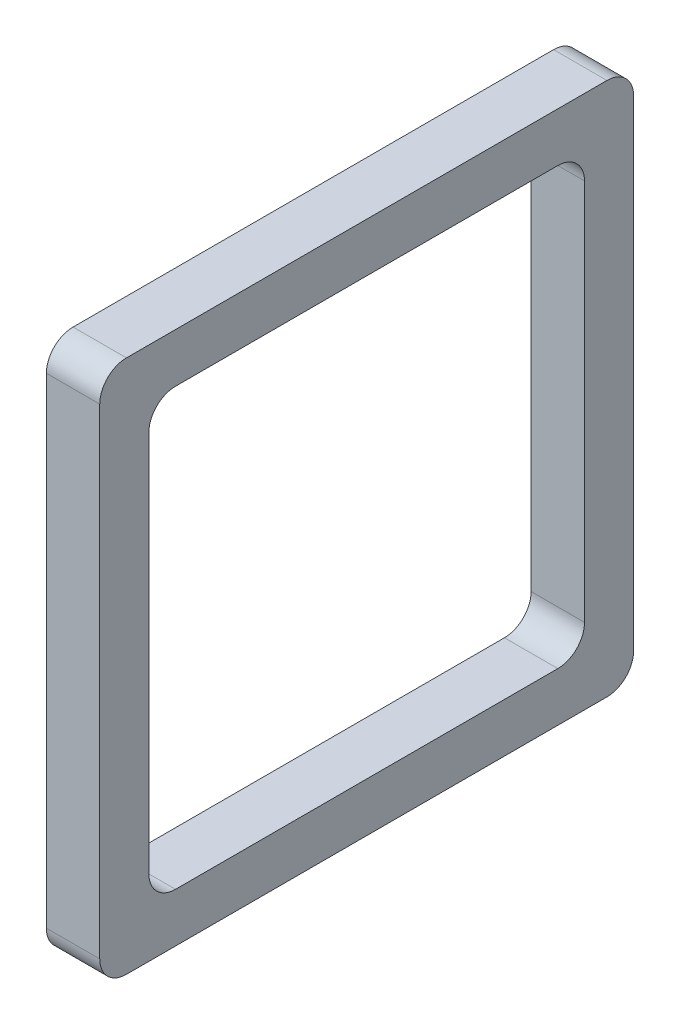
ISO-10303-21;
HEADER;
FILE_DESCRIPTION(('STEP AP214'),'2;1');
FILE_NAME('part.step','',(''),(''),'','','');
FILE_SCHEMA(('AUTOMOTIVE_DESIGN { 1 0 10303 214 1 1 1 1 }'));
ENDSEC;
DATA;
#1=APPLICATION_CONTEXT('core data for automotive mechanical design processes');
#2=APPLICATION_PROTOCOL_DEFINITION('international standard','automotive_design',2000,#1);
#3=PRODUCT_CONTEXT('',#1,'mechanical');
#4=PRODUCT('Part','Part','',(#3));
#5=PRODUCT_RELATED_PRODUCT_CATEGORY('part','',(#4));
#6=PRODUCT_DEFINITION_FORMATION('','',#4);
#7=PRODUCT_DEFINITION_CONTEXT('part definition',#1,'design');
#8=PRODUCT_DEFINITION('design','',#6,#7);
#9=PRODUCT_DEFINITION_SHAPE('','',#8);
#10=(LENGTH_UNIT() NAMED_UNIT(*) SI_UNIT(.MILLI.,.METRE.));
#11=(NAMED_UNIT(*) PLANE_ANGLE_UNIT() SI_UNIT($,.RADIAN.));
#12=(NAMED_UNIT(*) SI_UNIT($,.STERADIAN.) SOLID_ANGLE_UNIT());
#13=UNCERTAINTY_MEASURE_WITH_UNIT(LENGTH_MEASURE(1.E-05),#10,'distance_accuracy_value','');
#14=(GEOMETRIC_REPRESENTATION_CONTEXT(3) GLOBAL_UNCERTAINTY_ASSIGNED_CONTEXT((#13)) GLOBAL_UNIT_ASSIGNED_CONTEXT((#10,
#11,#12)) REPRESENTATION_CONTEXT('',''));
#15=CARTESIAN_POINT('',(0.,0.,0.));
#16=DIRECTION('',(0.,0.,1.));
#17=DIRECTION('',(1.,0.,0.));
#18=AXIS2_PLACEMENT_3D('',#15,#16,#17);
#19=CARTESIAN_POINT('',(1.5875,0.,0.));
#20=DIRECTION('',(-1.,0.,0.));
#21=DIRECTION('',(0.,0.,1.));
#22=AXIS2_PLACEMENT_3D('',#19,#20,#21);
#23=PLANE('',#22);
#24=DIRECTION('',(0.,1.,0.));
#25=VECTOR('',#24,1.);
#26=CARTESIAN_POINT('',(1.5875,0.,-31.75));
#27=LINE('',#26,#25);
#28=CARTESIAN_POINT('',(1.5875,1.5875,-31.75));
#29=VERTEX_POINT('',#28);
#30=CARTESIAN_POINT('',(1.5875,30.1625,-31.75));
#31=VERTEX_POINT('',#30);
#32=EDGE_CURVE('E175',#29,#31,#27,.T.);
#33=ORIENTED_EDGE('',*,*,#32,.T.);
#34=CARTESIAN_POINT('',(1.5875,30.1625,-30.1625));
#35=DIRECTION('',(-1.,0.,0.));
#36=DIRECTION('',(0.,0.,1.));
#37=AXIS2_PLACEMENT_3D('',#34,#35,#36);
#38=CIRCLE('',#37,1.5875);
#39=CARTESIAN_POINT('',(1.5875,31.75,-30.1625));
#40=VERTEX_POINT('',#39);
#41=EDGE_CURVE('E217',#31,#40,#38,.F.);
#42=ORIENTED_EDGE('',*,*,#41,.T.);
#43=DIRECTION('',(0.,0.,1.));
#44=VECTOR('',#43,1.);
#45=CARTESIAN_POINT('',(1.5875,31.75,0.));
#46=LINE('',#45,#44);
#47=CARTESIAN_POINT('',(1.5875,31.75,-1.5875));
#48=VERTEX_POINT('',#47);
#49=EDGE_CURVE('E170',#40,#48,#46,.T.);
#50=ORIENTED_EDGE('',*,*,#49,.T.);
#51=CARTESIAN_POINT('',(1.5875,30.1625,-1.5875));
#52=DIRECTION('',(-1.,0.,0.));
#53=DIRECTION('',(0.,0.,1.));
#54=AXIS2_PLACEMENT_3D('',#51,#52,#53);
#55=CIRCLE('',#54,1.5875);
#56=CARTESIAN_POINT('',(1.5875,30.1625,0.));
#57=VERTEX_POINT('',#56);
#58=EDGE_CURVE('E212',#48,#57,#55,.F.);
#59=ORIENTED_EDGE('',*,*,#58,.T.);
#60=DIRECTION('',(0.,-1.,0.));
#61=VECTOR('',#60,1.);
#62=CARTESIAN_POINT('',(1.5875,0.,0.));
#63=LINE('',#62,#61);
#64=CARTESIAN_POINT('',(1.5875,1.5875,0.));
#65=VERTEX_POINT('',#64);
#66=EDGE_CURVE('E266',#57,#65,#63,.T.);
#67=ORIENTED_EDGE('',*,*,#66,.T.);
#68=CARTESIAN_POINT('',(1.5875,1.5875,-1.5875));
#69=DIRECTION('',(-1.,0.,0.));
#70=DIRECTION('',(0.,0.,1.));
#71=AXIS2_PLACEMENT_3D('',#68,#69,#70);
#72=CIRCLE('',#71,1.5875);
#73=CARTESIAN_POINT('',(1.5875,0.,-1.5875));
#74=VERTEX_POINT('',#73);
#75=EDGE_CURVE('E55',#65,#74,#72,.F.);
#76=ORIENTED_EDGE('',*,*,#75,.T.);
#77=DIRECTION('',(0.,0.,-1.));
#78=VECTOR('',#77,1.);
#79=CARTESIAN_POINT('',(1.5875,0.,0.));
#80=LINE('',#79,#78);
#81=CARTESIAN_POINT('',(1.5875,0.,-30.1625));
#82=VERTEX_POINT('',#81);
#83=EDGE_CURVE('E268',#74,#82,#80,.T.);
#84=ORIENTED_EDGE('',*,*,#83,.T.);
#85=CARTESIAN_POINT('',(1.5875,1.5875,-30.1625));
#86=DIRECTION('',(-1.,0.,0.));
#87=DIRECTION('',(0.,0.,1.));
#88=AXIS2_PLACEMENT_3D('',#85,#86,#87);
#89=CIRCLE('',#88,1.5875);
#90=EDGE_CURVE('E215',#82,#29,#89,.F.);
#91=ORIENTED_EDGE('',*,*,#90,.T.);
#92=EDGE_LOOP('',(#33,#42,#50,#59,#67,#76,#84,#91));
#93=FACE_BOUND('',#92,.T.);
#94=DIRECTION('',(0.,0.,-1.));
#95=VECTOR('',#94,1.);
#96=CARTESIAN_POINT('',(1.5875,2.921,-2.921));
#97=LINE('',#96,#95);
#98=CARTESIAN_POINT('',(1.5875,2.921,-4.5085));
#99=VERTEX_POINT('',#98);
#100=CARTESIAN_POINT('',(1.5875,2.921,-27.2415));
#101=VERTEX_POINT('',#100);
#102=EDGE_CURVE('E260',#99,#101,#97,.T.);
#103=ORIENTED_EDGE('',*,*,#102,.F.);
#104=CARTESIAN_POINT('',(1.5875,4.5085,-4.5085));
#105=DIRECTION('',(-1.,0.,0.));
#106=DIRECTION('',(0.,0.,1.));
#107=AXIS2_PLACEMENT_3D('',#104,#105,#106);
#108=CIRCLE('',#107,1.5875);
#109=CARTESIAN_POINT('',(1.5875,4.5085,-2.921));
#110=VERTEX_POINT('',#109);
#111=EDGE_CURVE('E11',#99,#110,#108,.T.);
#112=ORIENTED_EDGE('',*,*,#111,.T.);
#113=DIRECTION('',(0.,-1.,0.));
#114=VECTOR('',#113,1.);
#115=CARTESIAN_POINT('',(1.5875,2.921,-2.921));
#116=LINE('',#115,#114);
#117=CARTESIAN_POINT('',(1.5875,27.2415,-2.921));
#118=VERTEX_POINT('',#117);
#119=EDGE_CURVE('E246',#118,#110,#116,.T.);
#120=ORIENTED_EDGE('',*,*,#119,.F.);
#121=CARTESIAN_POINT('',(1.5875,27.2415,-4.5085));
#122=DIRECTION('',(-1.,0.,0.));
#123=DIRECTION('',(0.,0.,1.));
#124=AXIS2_PLACEMENT_3D('',#121,#122,#123);
#125=CIRCLE('',#124,1.5875);
#126=CARTESIAN_POINT('',(1.5875,28.829,-4.5085));
#127=VERTEX_POINT('',#126);
#128=EDGE_CURVE('E157',#118,#127,#125,.T.);
#129=ORIENTED_EDGE('',*,*,#128,.T.);
#130=DIRECTION('',(0.,0.,1.));
#131=VECTOR('',#130,1.);
#132=CARTESIAN_POINT('',(1.5875,28.829,-2.921));
#133=LINE('',#132,#131);
#134=CARTESIAN_POINT('',(1.5875,28.829,-27.2415));
#135=VERTEX_POINT('',#134);
#136=EDGE_CURVE('E243',#135,#127,#133,.T.);
#137=ORIENTED_EDGE('',*,*,#136,.F.);
#138=CARTESIAN_POINT('',(1.5875,27.2415,-27.2415));
#139=DIRECTION('',(-1.,0.,0.));
#140=DIRECTION('',(0.,0.,1.));
#141=AXIS2_PLACEMENT_3D('',#138,#139,#140);
#142=CIRCLE('',#141,1.5875);
#143=CARTESIAN_POINT('',(1.5875,27.2415,-28.829));
#144=VERTEX_POINT('',#143);
#145=EDGE_CURVE('E234',#135,#144,#142,.T.);
#146=ORIENTED_EDGE('',*,*,#145,.T.);
#147=DIRECTION('',(0.,1.,0.));
#148=VECTOR('',#147,1.);
#149=CARTESIAN_POINT('',(1.5875,2.921,-28.829));
#150=LINE('',#149,#148);
#151=CARTESIAN_POINT('',(1.5875,4.5085,-28.829));
#152=VERTEX_POINT('',#151);
#153=EDGE_CURVE('E254',#152,#144,#150,.T.);
#154=ORIENTED_EDGE('',*,*,#153,.F.);
#155=CARTESIAN_POINT('',(1.5875,4.5085,-27.2415));
#156=DIRECTION('',(-1.,0.,0.));
#157=DIRECTION('',(0.,0.,1.));
#158=AXIS2_PLACEMENT_3D('',#155,#156,#157);
#159=CIRCLE('',#158,1.5875);
#160=EDGE_CURVE('E230',#152,#101,#159,.T.);
#161=ORIENTED_EDGE('',*,*,#160,.T.);
#162=EDGE_LOOP('',(#103,#112,#120,#129,#137,#146,#154,#161));
#163=FACE_BOUND('',#162,.T.);
#164=ADVANCED_FACE('F33',(#93,#163),#23,.F.);
#165=CARTESIAN_POINT('',(-1.5875,0.,0.));
#166=DIRECTION('',(-1.,0.,0.));
#167=DIRECTION('',(0.,0.,1.));
#168=AXIS2_PLACEMENT_3D('',#165,#166,#167);
#169=PLANE('',#168);
#170=DIRECTION('',(0.,0.,1.));
#171=VECTOR('',#170,1.);
#172=CARTESIAN_POINT('',(-1.5875,31.75,0.));
#173=LINE('',#172,#171);
#174=CARTESIAN_POINT('',(-1.5875,31.75,-30.1625));
#175=VERTEX_POINT('',#174);
#176=CARTESIAN_POINT('',(-1.5875,31.75,-1.5875));
#177=VERTEX_POINT('',#176);
#178=EDGE_CURVE('E178',#175,#177,#173,.T.);
#179=ORIENTED_EDGE('',*,*,#178,.F.);
#180=CARTESIAN_POINT('',(-1.5875,30.1625,-30.1625));
#181=DIRECTION('',(-1.,0.,0.));
#182=DIRECTION('',(0.,0.,1.));
#183=AXIS2_PLACEMENT_3D('',#180,#181,#182);
#184=CIRCLE('',#183,1.5875);
#185=CARTESIAN_POINT('',(-1.5875,30.1625,-31.75));
#186=VERTEX_POINT('',#185);
#187=EDGE_CURVE('E205',#175,#186,#184,.T.);
#188=ORIENTED_EDGE('',*,*,#187,.T.);
#189=DIRECTION('',(0.,1.,0.));
#190=VECTOR('',#189,1.);
#191=CARTESIAN_POINT('',(-1.5875,0.,-31.75));
#192=LINE('',#191,#190);
#193=CARTESIAN_POINT('',(-1.5875,1.5875,-31.75));
#194=VERTEX_POINT('',#193);
#195=EDGE_CURVE('E276',#194,#186,#192,.T.);
#196=ORIENTED_EDGE('',*,*,#195,.F.);
#197=CARTESIAN_POINT('',(-1.5875,1.5875,-30.1625));
#198=DIRECTION('',(-1.,0.,0.));
#199=DIRECTION('',(0.,0.,1.));
#200=AXIS2_PLACEMENT_3D('',#197,#198,#199);
#201=CIRCLE('',#200,1.5875);
#202=CARTESIAN_POINT('',(-1.5875,0.,-30.1625));
#203=VERTEX_POINT('',#202);
#204=EDGE_CURVE('E203',#194,#203,#201,.T.);
#205=ORIENTED_EDGE('',*,*,#204,.T.);
#206=DIRECTION('',(0.,0.,-1.));
#207=VECTOR('',#206,1.);
#208=CARTESIAN_POINT('',(-1.5875,0.,0.));
#209=LINE('',#208,#207);
#210=CARTESIAN_POINT('',(-1.5875,0.,-1.5875));
#211=VERTEX_POINT('',#210);
#212=EDGE_CURVE('E275',#211,#203,#209,.T.);
#213=ORIENTED_EDGE('',*,*,#212,.F.);
#214=CARTESIAN_POINT('',(-1.5875,1.5875,-1.5875));
#215=DIRECTION('',(-1.,0.,0.));
#216=DIRECTION('',(0.,0.,1.));
#217=AXIS2_PLACEMENT_3D('',#214,#215,#216);
#218=CIRCLE('',#217,1.5875);
#219=CARTESIAN_POINT('',(-1.5875,1.5875,0.));
#220=VERTEX_POINT('',#219);
#221=EDGE_CURVE('E201',#211,#220,#218,.T.);
#222=ORIENTED_EDGE('',*,*,#221,.T.);
#223=DIRECTION('',(0.,-1.,0.));
#224=VECTOR('',#223,1.);
#225=CARTESIAN_POINT('',(-1.5875,0.,0.));
#226=LINE('',#225,#224);
#227=CARTESIAN_POINT('',(-1.5875,30.1625,0.));
#228=VERTEX_POINT('',#227);
#229=EDGE_CURVE('E272',#228,#220,#226,.T.);
#230=ORIENTED_EDGE('',*,*,#229,.F.);
#231=CARTESIAN_POINT('',(-1.5875,30.1625,-1.5875));
#232=DIRECTION('',(-1.,0.,0.));
#233=DIRECTION('',(0.,0.,1.));
#234=AXIS2_PLACEMENT_3D('',#231,#232,#233);
#235=CIRCLE('',#234,1.5875);
#236=EDGE_CURVE('E199',#228,#177,#235,.T.);
#237=ORIENTED_EDGE('',*,*,#236,.T.);
#238=EDGE_LOOP('',(#179,#188,#196,#205,#213,#222,#230,#237));
#239=FACE_BOUND('',#238,.T.);
#240=DIRECTION('',(0.,0.,1.));
#241=VECTOR('',#240,1.);
#242=CARTESIAN_POINT('',(-1.5875,28.829,-2.921));
#243=LINE('',#242,#241);
#244=CARTESIAN_POINT('',(-1.5875,28.829,-27.2415));
#245=VERTEX_POINT('',#244);
#246=CARTESIAN_POINT('',(-1.5875,28.829,-4.5085));
#247=VERTEX_POINT('',#246);
#248=EDGE_CURVE('E257',#245,#247,#243,.T.);
#249=ORIENTED_EDGE('',*,*,#248,.T.);
#250=CARTESIAN_POINT('',(-1.5875,27.2415,-4.5085));
#251=DIRECTION('',(-1.,0.,0.));
#252=DIRECTION('',(0.,0.,1.));
#253=AXIS2_PLACEMENT_3D('',#250,#251,#252);
#254=CIRCLE('',#253,1.5875);
#255=CARTESIAN_POINT('',(-1.5875,27.2415,-2.921));
#256=VERTEX_POINT('',#255);
#257=EDGE_CURVE('E236',#247,#256,#254,.F.);
#258=ORIENTED_EDGE('',*,*,#257,.T.);
#259=DIRECTION('',(0.,-1.,0.));
#260=VECTOR('',#259,1.);
#261=CARTESIAN_POINT('',(-1.5875,2.921,-2.921));
#262=LINE('',#261,#260);
#263=CARTESIAN_POINT('',(-1.5875,4.5085,-2.921));
#264=VERTEX_POINT('',#263);
#265=EDGE_CURVE('E152',#256,#264,#262,.T.);
#266=ORIENTED_EDGE('',*,*,#265,.T.);
#267=CARTESIAN_POINT('',(-1.5875,4.5085,-4.5085));
#268=DIRECTION('',(-1.,0.,0.));
#269=DIRECTION('',(0.,0.,1.));
#270=AXIS2_PLACEMENT_3D('',#267,#268,#269);
#271=CIRCLE('',#270,1.5875);
#272=CARTESIAN_POINT('',(-1.5875,2.921,-4.5085));
#273=VERTEX_POINT('',#272);
#274=EDGE_CURVE('E41',#264,#273,#271,.F.);
#275=ORIENTED_EDGE('',*,*,#274,.T.);
#276=DIRECTION('',(0.,0.,-1.));
#277=VECTOR('',#276,1.);
#278=CARTESIAN_POINT('',(-1.5875,2.921,-2.921));
#279=LINE('',#278,#277);
#280=CARTESIAN_POINT('',(-1.5875,2.921,-27.2415));
#281=VERTEX_POINT('',#280);
#282=EDGE_CURVE('E150',#273,#281,#279,.T.);
#283=ORIENTED_EDGE('',*,*,#282,.T.);
#284=CARTESIAN_POINT('',(-1.5875,4.5085,-27.2415));
#285=DIRECTION('',(-1.,0.,0.));
#286=DIRECTION('',(0.,0.,1.));
#287=AXIS2_PLACEMENT_3D('',#284,#285,#286);
#288=CIRCLE('',#287,1.5875);
#289=CARTESIAN_POINT('',(-1.5875,4.5085,-28.829));
#290=VERTEX_POINT('',#289);
#291=EDGE_CURVE('E228',#281,#290,#288,.F.);
#292=ORIENTED_EDGE('',*,*,#291,.T.);
#293=DIRECTION('',(0.,1.,0.));
#294=VECTOR('',#293,1.);
#295=CARTESIAN_POINT('',(-1.5875,2.921,-28.829));
#296=LINE('',#295,#294);
#297=CARTESIAN_POINT('',(-1.5875,27.2415,-28.829));
#298=VERTEX_POINT('',#297);
#299=EDGE_CURVE('E166',#290,#298,#296,.T.);
#300=ORIENTED_EDGE('',*,*,#299,.T.);
#301=CARTESIAN_POINT('',(-1.5875,27.2415,-27.2415));
#302=DIRECTION('',(-1.,0.,0.));
#303=DIRECTION('',(0.,0.,1.));
#304=AXIS2_PLACEMENT_3D('',#301,#302,#303);
#305=CIRCLE('',#304,1.5875);
#306=EDGE_CURVE('E232',#298,#245,#305,.F.);
#307=ORIENTED_EDGE('',*,*,#306,.T.);
#308=EDGE_LOOP('',(#249,#258,#266,#275,#283,#292,#300,#307));
#309=FACE_BOUND('',#308,.T.);
#310=ADVANCED_FACE('F149',(#239,#309),#169,.T.);
#311=CARTESIAN_POINT('',(1.5875,0.,0.));
#312=DIRECTION('',(0.,0.,-1.));
#313=DIRECTION('',(-1.,0.,0.));
#314=AXIS2_PLACEMENT_3D('',#311,#312,#313);
#315=PLANE('',#314);
#316=ORIENTED_EDGE('',*,*,#229,.T.);
#317=DIRECTION('',(-1.,0.,0.));
#318=VECTOR('',#317,1.);
#319=CARTESIAN_POINT('',(1.5875,1.5875,0.));
#320=LINE('',#319,#318);
#321=EDGE_CURVE('E226',#220,#65,#320,.F.);
#322=ORIENTED_EDGE('',*,*,#321,.T.);
#323=ORIENTED_EDGE('',*,*,#66,.F.);
#324=DIRECTION('',(-1.,0.,0.));
#325=VECTOR('',#324,1.);
#326=CARTESIAN_POINT('',(1.5875,30.1625,0.));
#327=LINE('',#326,#325);
#328=EDGE_CURVE('E223',#57,#228,#327,.T.);
#329=ORIENTED_EDGE('',*,*,#328,.T.);
#330=EDGE_LOOP('',(#316,#322,#323,#329));
#331=FACE_BOUND('',#330,.T.);
#332=ADVANCED_FACE('F294',(#331),#315,.F.);
#333=CARTESIAN_POINT('',(1.5875,0.,0.));
#334=DIRECTION('',(0.,1.,0.));
#335=DIRECTION('',(0.,0.,1.));
#336=AXIS2_PLACEMENT_3D('',#333,#334,#335);
#337=PLANE('',#336);
#338=ORIENTED_EDGE('',*,*,#212,.T.);
#339=DIRECTION('',(-1.,0.,0.));
#340=VECTOR('',#339,1.);
#341=CARTESIAN_POINT('',(1.5875,0.,-30.1625));
#342=LINE('',#341,#340);
#343=EDGE_CURVE('E48',#203,#82,#342,.F.);
#344=ORIENTED_EDGE('',*,*,#343,.T.);
#345=ORIENTED_EDGE('',*,*,#83,.F.);
#346=DIRECTION('',(-1.,0.,0.));
#347=VECTOR('',#346,1.);
#348=CARTESIAN_POINT('',(1.5875,0.,-1.5875));
#349=LINE('',#348,#347);
#350=EDGE_CURVE('E219',#74,#211,#349,.T.);
#351=ORIENTED_EDGE('',*,*,#350,.T.);
#352=EDGE_LOOP('',(#338,#344,#345,#351));
#353=FACE_BOUND('',#352,.T.);
#354=ADVANCED_FACE('F301',(#353),#337,.F.);
#355=CARTESIAN_POINT('',(1.5875,0.,-31.75));
#356=DIRECTION('',(0.,0.,1.));
#357=DIRECTION('',(1.,0.,0.));
#358=AXIS2_PLACEMENT_3D('',#355,#356,#357);
#359=PLANE('',#358);
#360=ORIENTED_EDGE('',*,*,#195,.T.);
#361=DIRECTION('',(-1.,0.,0.));
#362=VECTOR('',#361,1.);
#363=CARTESIAN_POINT('',(1.5875,30.1625,-31.75));
#364=LINE('',#363,#362);
#365=EDGE_CURVE('E210',#186,#31,#364,.F.);
#366=ORIENTED_EDGE('',*,*,#365,.T.);
#367=ORIENTED_EDGE('',*,*,#32,.F.);
#368=DIRECTION('',(-1.,0.,0.));
#369=VECTOR('',#368,1.);
#370=CARTESIAN_POINT('',(1.5875,1.5875,-31.75));
#371=LINE('',#370,#369);
#372=EDGE_CURVE('E207',#29,#194,#371,.T.);
#373=ORIENTED_EDGE('',*,*,#372,.T.);
#374=EDGE_LOOP('',(#360,#366,#367,#373));
#375=FACE_BOUND('',#374,.T.);
#376=ADVANCED_FACE('F307',(#375),#359,.F.);
#377=CARTESIAN_POINT('',(1.5875,31.75,0.));
#378=DIRECTION('',(0.,-1.,0.));
#379=DIRECTION('',(0.,0.,-1.));
#380=AXIS2_PLACEMENT_3D('',#377,#378,#379);
#381=PLANE('',#380);
#382=ORIENTED_EDGE('',*,*,#49,.F.);
#383=DIRECTION('',(-1.,0.,0.));
#384=VECTOR('',#383,1.);
#385=CARTESIAN_POINT('',(1.5875,31.75,-30.1625));
#386=LINE('',#385,#384);
#387=EDGE_CURVE('E196',#40,#175,#386,.T.);
#388=ORIENTED_EDGE('',*,*,#387,.T.);
#389=ORIENTED_EDGE('',*,*,#178,.T.);
#390=DIRECTION('',(-1.,0.,0.));
#391=VECTOR('',#390,1.);
#392=CARTESIAN_POINT('',(1.5875,31.75,-1.5875));
#393=LINE('',#392,#391);
#394=EDGE_CURVE('E194',#177,#48,#393,.F.);
#395=ORIENTED_EDGE('',*,*,#394,.T.);
#396=EDGE_LOOP('',(#382,#388,#389,#395));
#397=FACE_BOUND('',#396,.T.);
#398=ADVANCED_FACE('F286',(#397),#381,.F.);
#399=CARTESIAN_POINT('',(1.5875,2.921,-2.921));
#400=DIRECTION('',(0.,1.,0.));
#401=DIRECTION('',(0.,0.,1.));
#402=AXIS2_PLACEMENT_3D('',#399,#400,#401);
#403=PLANE('',#402);
#404=ORIENTED_EDGE('',*,*,#102,.T.);
#405=DIRECTION('',(-1.,0.,0.));
#406=VECTOR('',#405,1.);
#407=CARTESIAN_POINT('',(-1.5875,2.921,-27.2415));
#408=LINE('',#407,#406);
#409=EDGE_CURVE('E165',#101,#281,#408,.T.);
#410=ORIENTED_EDGE('',*,*,#409,.T.);
#411=ORIENTED_EDGE('',*,*,#282,.F.);
#412=DIRECTION('',(-1.,0.,0.));
#413=VECTOR('',#412,1.);
#414=CARTESIAN_POINT('',(1.5875,2.921,-4.5085));
#415=LINE('',#414,#413);
#416=EDGE_CURVE('E162',#273,#99,#415,.F.);
#417=ORIENTED_EDGE('',*,*,#416,.T.);
#418=EDGE_LOOP('',(#404,#410,#411,#417));
#419=FACE_BOUND('',#418,.T.);
#420=ADVANCED_FACE('F161',(#419),#403,.T.);
#421=CARTESIAN_POINT('',(1.5875,2.921,-28.829));
#422=DIRECTION('',(0.,0.,1.));
#423=DIRECTION('',(1.,0.,0.));
#424=AXIS2_PLACEMENT_3D('',#421,#422,#423);
#425=PLANE('',#424);
#426=ORIENTED_EDGE('',*,*,#299,.F.);
#427=DIRECTION('',(-1.,0.,0.));
#428=VECTOR('',#427,1.);
#429=CARTESIAN_POINT('',(1.5875,4.5085,-28.829));
#430=LINE('',#429,#428);
#431=EDGE_CURVE('E183',#290,#152,#430,.F.);
#432=ORIENTED_EDGE('',*,*,#431,.T.);
#433=ORIENTED_EDGE('',*,*,#153,.T.);
#434=DIRECTION('',(-1.,0.,0.));
#435=VECTOR('',#434,1.);
#436=CARTESIAN_POINT('',(-1.5875,27.2415,-28.829));
#437=LINE('',#436,#435);
#438=EDGE_CURVE('E172',#144,#298,#437,.T.);
#439=ORIENTED_EDGE('',*,*,#438,.T.);
#440=EDGE_LOOP('',(#426,#432,#433,#439));
#441=FACE_BOUND('',#440,.T.);
#442=ADVANCED_FACE('F405',(#441),#425,.T.);
#443=CARTESIAN_POINT('',(1.5875,28.829,-2.921));
#444=DIRECTION('',(0.,-1.,0.));
#445=DIRECTION('',(0.,0.,-1.));
#446=AXIS2_PLACEMENT_3D('',#443,#444,#445);
#447=PLANE('',#446);
#448=ORIENTED_EDGE('',*,*,#248,.F.);
#449=DIRECTION('',(-1.,0.,0.));
#450=VECTOR('',#449,1.);
#451=CARTESIAN_POINT('',(1.5875,28.829,-27.2415));
#452=LINE('',#451,#450);
#453=EDGE_CURVE('E188',#245,#135,#452,.F.);
#454=ORIENTED_EDGE('',*,*,#453,.T.);
#455=ORIENTED_EDGE('',*,*,#136,.T.);
#456=DIRECTION('',(-1.,0.,0.));
#457=VECTOR('',#456,1.);
#458=CARTESIAN_POINT('',(-1.5875,28.829,-4.5085));
#459=LINE('',#458,#457);
#460=EDGE_CURVE('E185',#127,#247,#459,.T.);
#461=ORIENTED_EDGE('',*,*,#460,.T.);
#462=EDGE_LOOP('',(#448,#454,#455,#461));
#463=FACE_BOUND('',#462,.T.);
#464=ADVANCED_FACE('F252',(#463),#447,.T.);
#465=CARTESIAN_POINT('',(1.5875,2.921,-2.921));
#466=DIRECTION('',(0.,0.,-1.));
#467=DIRECTION('',(-1.,0.,0.));
#468=AXIS2_PLACEMENT_3D('',#465,#466,#467);
#469=PLANE('',#468);
#470=ORIENTED_EDGE('',*,*,#265,.F.);
#471=DIRECTION('',(-1.,0.,0.));
#472=VECTOR('',#471,1.);
#473=CARTESIAN_POINT('',(1.5875,27.2415,-2.921));
#474=LINE('',#473,#472);
#475=EDGE_CURVE('E192',#256,#118,#474,.F.);
#476=ORIENTED_EDGE('',*,*,#475,.T.);
#477=ORIENTED_EDGE('',*,*,#119,.T.);
#478=DIRECTION('',(-1.,0.,0.));
#479=VECTOR('',#478,1.);
#480=CARTESIAN_POINT('',(-1.5875,4.5085,-2.921));
#481=LINE('',#480,#479);
#482=EDGE_CURVE('E190',#110,#264,#481,.T.);
#483=ORIENTED_EDGE('',*,*,#482,.T.);
#484=EDGE_LOOP('',(#470,#476,#477,#483));
#485=FACE_BOUND('',#484,.T.);
#486=ADVANCED_FACE('F259',(#485),#469,.T.);
#487=CARTESIAN_POINT('',(1.5875,4.5085,-27.2415));
#488=DIRECTION('',(1.,0.,0.));
#489=DIRECTION('',(0.,0.,-1.));
#490=AXIS2_PLACEMENT_3D('',#487,#488,#489);
#491=CYLINDRICAL_SURFACE('',#490,1.5875);
#492=ORIENTED_EDGE('',*,*,#160,.F.);
#493=ORIENTED_EDGE('',*,*,#431,.F.);
#494=ORIENTED_EDGE('',*,*,#291,.F.);
#495=ORIENTED_EDGE('',*,*,#409,.F.);
#496=EDGE_LOOP('',(#492,#493,#494,#495));
#497=FACE_BOUND('',#496,.T.);
#498=ADVANCED_FACE('F336',(#497),#491,.F.);
#499=CARTESIAN_POINT('',(1.5875,27.2415,-27.2415));
#500=DIRECTION('',(1.,0.,0.));
#501=DIRECTION('',(0.,0.,-1.));
#502=AXIS2_PLACEMENT_3D('',#499,#500,#501);
#503=CYLINDRICAL_SURFACE('',#502,1.5875);
#504=ORIENTED_EDGE('',*,*,#145,.F.);
#505=ORIENTED_EDGE('',*,*,#453,.F.);
#506=ORIENTED_EDGE('',*,*,#306,.F.);
#507=ORIENTED_EDGE('',*,*,#438,.F.);
#508=EDGE_LOOP('',(#504,#505,#506,#507));
#509=FACE_BOUND('',#508,.T.);
#510=ADVANCED_FACE('F339',(#509),#503,.F.);
#511=CARTESIAN_POINT('',(1.5875,27.2415,-4.5085));
#512=DIRECTION('',(1.,0.,0.));
#513=DIRECTION('',(0.,0.,-1.));
#514=AXIS2_PLACEMENT_3D('',#511,#512,#513);
#515=CYLINDRICAL_SURFACE('',#514,1.5875);
#516=ORIENTED_EDGE('',*,*,#128,.F.);
#517=ORIENTED_EDGE('',*,*,#475,.F.);
#518=ORIENTED_EDGE('',*,*,#257,.F.);
#519=ORIENTED_EDGE('',*,*,#460,.F.);
#520=EDGE_LOOP('',(#516,#517,#518,#519));
#521=FACE_BOUND('',#520,.T.);
#522=ADVANCED_FACE('F256',(#521),#515,.F.);
#523=CARTESIAN_POINT('',(1.5875,4.5085,-4.5085));
#524=DIRECTION('',(1.,0.,0.));
#525=DIRECTION('',(0.,0.,-1.));
#526=AXIS2_PLACEMENT_3D('',#523,#524,#525);
#527=CYLINDRICAL_SURFACE('',#526,1.5875);
#528=ORIENTED_EDGE('',*,*,#111,.F.);
#529=ORIENTED_EDGE('',*,*,#416,.F.);
#530=ORIENTED_EDGE('',*,*,#274,.F.);
#531=ORIENTED_EDGE('',*,*,#482,.F.);
#532=EDGE_LOOP('',(#528,#529,#530,#531));
#533=FACE_BOUND('',#532,.T.);
#534=ADVANCED_FACE('F169',(#533),#527,.F.);
#535=CARTESIAN_POINT('',(1.5875,30.1625,-30.1625));
#536=DIRECTION('',(-1.,0.,0.));
#537=DIRECTION('',(0.,0.,1.));
#538=AXIS2_PLACEMENT_3D('',#535,#536,#537);
#539=CYLINDRICAL_SURFACE('',#538,1.5875);
#540=ORIENTED_EDGE('',*,*,#41,.F.);
#541=ORIENTED_EDGE('',*,*,#365,.F.);
#542=ORIENTED_EDGE('',*,*,#187,.F.);
#543=ORIENTED_EDGE('',*,*,#387,.F.);
#544=EDGE_LOOP('',(#540,#541,#542,#543));
#545=FACE_BOUND('',#544,.T.);
#546=ADVANCED_FACE('F310',(#545),#539,.T.);
#547=CARTESIAN_POINT('',(1.5875,1.5875,-30.1625));
#548=DIRECTION('',(-1.,0.,0.));
#549=DIRECTION('',(0.,0.,1.));
#550=AXIS2_PLACEMENT_3D('',#547,#548,#549);
#551=CYLINDRICAL_SURFACE('',#550,1.5875);
#552=ORIENTED_EDGE('',*,*,#90,.F.);
#553=ORIENTED_EDGE('',*,*,#343,.F.);
#554=ORIENTED_EDGE('',*,*,#204,.F.);
#555=ORIENTED_EDGE('',*,*,#372,.F.);
#556=EDGE_LOOP('',(#552,#553,#554,#555));
#557=FACE_BOUND('',#556,.T.);
#558=ADVANCED_FACE('F305',(#557),#551,.T.);
#559=CARTESIAN_POINT('',(1.5875,1.5875,-1.5875));
#560=DIRECTION('',(-1.,0.,0.));
#561=DIRECTION('',(0.,0.,1.));
#562=AXIS2_PLACEMENT_3D('',#559,#560,#561);
#563=CYLINDRICAL_SURFACE('',#562,1.5875);
#564=ORIENTED_EDGE('',*,*,#75,.F.);
#565=ORIENTED_EDGE('',*,*,#321,.F.);
#566=ORIENTED_EDGE('',*,*,#221,.F.);
#567=ORIENTED_EDGE('',*,*,#350,.F.);
#568=EDGE_LOOP('',(#564,#565,#566,#567));
#569=FACE_BOUND('',#568,.T.);
#570=ADVANCED_FACE('F298',(#569),#563,.T.);
#571=CARTESIAN_POINT('',(1.5875,30.1625,-1.5875));
#572=DIRECTION('',(-1.,0.,0.));
#573=DIRECTION('',(0.,0.,1.));
#574=AXIS2_PLACEMENT_3D('',#571,#572,#573);
#575=CYLINDRICAL_SURFACE('',#574,1.5875);
#576=ORIENTED_EDGE('',*,*,#58,.F.);
#577=ORIENTED_EDGE('',*,*,#394,.F.);
#578=ORIENTED_EDGE('',*,*,#236,.F.);
#579=ORIENTED_EDGE('',*,*,#328,.F.);
#580=EDGE_LOOP('',(#576,#577,#578,#579));
#581=FACE_BOUND('',#580,.T.);
#582=ADVANCED_FACE('F35',(#581),#575,.T.);
#583=CLOSED_SHELL('',(#164,#310,#332,#354,#376,#398,#420,#442,#464,#486,#498,#510,#522,#534,
#546,#558,#570,#582));
#584=MANIFOLD_SOLID_BREP('B2',#583);
#585=ADVANCED_BREP_SHAPE_REPRESENTATION('',(#18,#584),#14);
#586=SHAPE_DEFINITION_REPRESENTATION(#9,#585);
ENDSEC;
END-ISO-10303-21;
